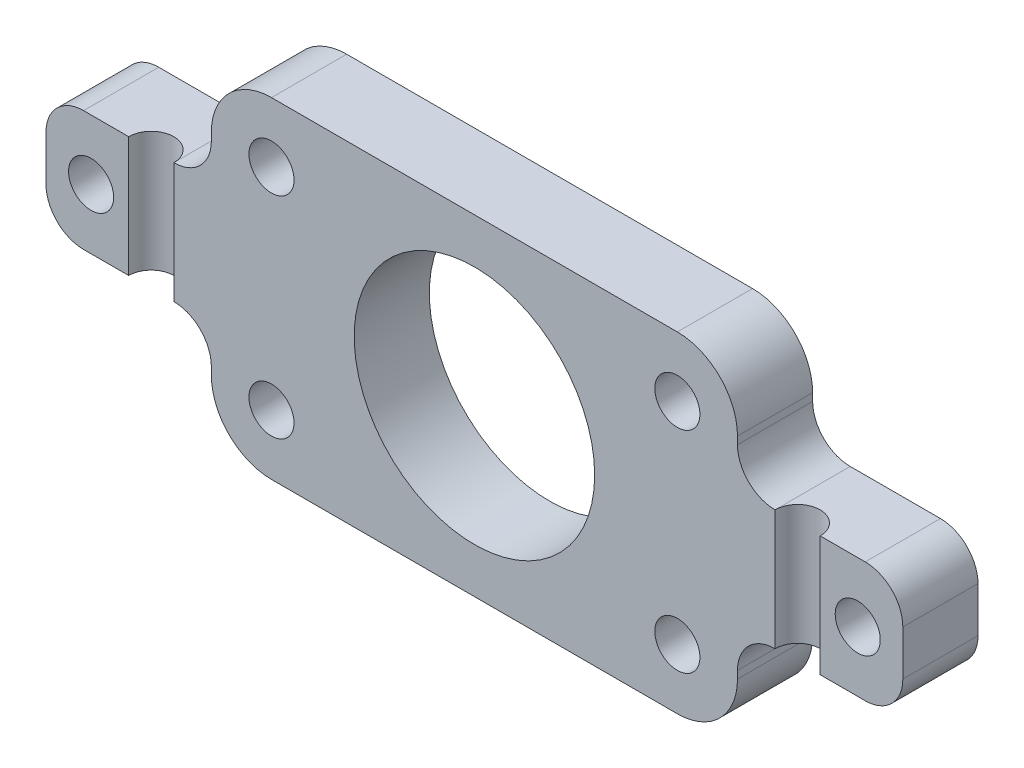
ISO-10303-21;
HEADER;
FILE_DESCRIPTION(('STEP AP214'),'2;1');
FILE_NAME('part.step','',(''),(''),'','','');
FILE_SCHEMA(('AUTOMOTIVE_DESIGN { 1 0 10303 214 1 1 1 1 }'));
ENDSEC;
DATA;
#1=APPLICATION_CONTEXT('core data for automotive mechanical design processes');
#2=APPLICATION_PROTOCOL_DEFINITION('international standard','automotive_design',2000,#1);
#3=PRODUCT_CONTEXT('',#1,'mechanical');
#4=PRODUCT('Part','Part','',(#3));
#5=PRODUCT_RELATED_PRODUCT_CATEGORY('part','',(#4));
#6=PRODUCT_DEFINITION_FORMATION('','',#4);
#7=PRODUCT_DEFINITION_CONTEXT('part definition',#1,'design');
#8=PRODUCT_DEFINITION('design','',#6,#7);
#9=PRODUCT_DEFINITION_SHAPE('','',#8);
#10=(LENGTH_UNIT() NAMED_UNIT(*) SI_UNIT(.MILLI.,.METRE.));
#11=(NAMED_UNIT(*) PLANE_ANGLE_UNIT() SI_UNIT($,.RADIAN.));
#12=(NAMED_UNIT(*) SI_UNIT($,.STERADIAN.) SOLID_ANGLE_UNIT());
#13=UNCERTAINTY_MEASURE_WITH_UNIT(LENGTH_MEASURE(1.E-05),#10,'distance_accuracy_value','');
#14=(GEOMETRIC_REPRESENTATION_CONTEXT(3) GLOBAL_UNCERTAINTY_ASSIGNED_CONTEXT((#13)) GLOBAL_UNIT_ASSIGNED_CONTEXT((#10,
#11,#12)) REPRESENTATION_CONTEXT('',''));
#15=CARTESIAN_POINT('',(0.,0.,0.));
#16=DIRECTION('',(0.,0.,1.));
#17=DIRECTION('',(1.,0.,0.));
#18=AXIS2_PLACEMENT_3D('',#15,#16,#17);
#19=CARTESIAN_POINT('',(15.,4.,5.));
#20=DIRECTION('',(0.,0.,1.));
#21=DIRECTION('',(1.,0.,0.));
#22=AXIS2_PLACEMENT_3D('',#19,#20,#21);
#23=PLANE('',#22);
#24=DIRECTION('',(0.,1.,0.));
#25=VECTOR('',#24,1.);
#26=CARTESIAN_POINT('',(8.5,3.5,5.));
#27=LINE('',#26,#25);
#28=CARTESIAN_POINT('',(8.5,7.,5.));
#29=VERTEX_POINT('',#28);
#30=CARTESIAN_POINT('',(8.5,15.,5.));
#31=VERTEX_POINT('',#30);
#32=EDGE_CURVE('E205',#29,#31,#27,.T.);
#33=ORIENTED_EDGE('',*,*,#32,.F.);
#34=CARTESIAN_POINT('',(8.5,4.5,5.));
#35=DIRECTION('',(0.,0.,-1.));
#36=DIRECTION('',(1.,0.,0.));
#37=AXIS2_PLACEMENT_3D('',#34,#35,#36);
#38=CIRCLE('',#37,2.5);
#39=CARTESIAN_POINT('',(11.,4.5,5.));
#40=VERTEX_POINT('',#39);
#41=EDGE_CURVE('E388',#29,#40,#38,.T.);
#42=ORIENTED_EDGE('',*,*,#41,.T.);
#43=DIRECTION('',(0.,-1.,0.));
#44=VECTOR('',#43,1.);
#45=CARTESIAN_POINT('',(11.,4.5,5.));
#46=LINE('',#45,#44);
#47=CARTESIAN_POINT('',(11.,4.,5.));
#48=VERTEX_POINT('',#47);
#49=EDGE_CURVE('E353',#40,#48,#46,.T.);
#50=ORIENTED_EDGE('',*,*,#49,.T.);
#51=CARTESIAN_POINT('',(15.,4.,5.));
#52=DIRECTION('',(0.,0.,1.));
#53=DIRECTION('',(1.,0.,0.));
#54=AXIS2_PLACEMENT_3D('',#51,#52,#53);
#55=CIRCLE('',#54,4.);
#56=CARTESIAN_POINT('',(15.,0.,5.));
#57=VERTEX_POINT('',#56);
#58=EDGE_CURVE('E348',#48,#57,#55,.T.);
#59=ORIENTED_EDGE('',*,*,#58,.T.);
#60=DIRECTION('',(1.,0.,0.));
#61=VECTOR('',#60,1.);
#62=CARTESIAN_POINT('',(15.,0.,5.));
#63=LINE('',#62,#61);
#64=CARTESIAN_POINT('',(42.,0.,5.));
#65=VERTEX_POINT('',#64);
#66=EDGE_CURVE('E413',#57,#65,#63,.T.);
#67=ORIENTED_EDGE('',*,*,#66,.T.);
#68=CARTESIAN_POINT('',(42.,4.,5.));
#69=DIRECTION('',(0.,0.,1.));
#70=DIRECTION('',(-1.,0.,0.));
#71=AXIS2_PLACEMENT_3D('',#68,#69,#70);
#72=CIRCLE('',#71,4.);
#73=CARTESIAN_POINT('',(46.,4.,5.));
#74=VERTEX_POINT('',#73);
#75=EDGE_CURVE('E293',#65,#74,#72,.T.);
#76=ORIENTED_EDGE('',*,*,#75,.T.);
#77=DIRECTION('',(0.,1.,0.));
#78=VECTOR('',#77,1.);
#79=CARTESIAN_POINT('',(46.,4.5,5.));
#80=LINE('',#79,#78);
#81=CARTESIAN_POINT('',(46.,4.5,5.));
#82=VERTEX_POINT('',#81);
#83=EDGE_CURVE('E416',#74,#82,#80,.T.);
#84=ORIENTED_EDGE('',*,*,#83,.T.);
#85=CARTESIAN_POINT('',(48.5,4.5,5.));
#86=DIRECTION('',(0.,0.,-1.));
#87=DIRECTION('',(-1.,0.,0.));
#88=AXIS2_PLACEMENT_3D('',#85,#86,#87);
#89=CIRCLE('',#88,2.5);
#90=CARTESIAN_POINT('',(48.5,7.,5.));
#91=VERTEX_POINT('',#90);
#92=EDGE_CURVE('E418',#82,#91,#89,.T.);
#93=ORIENTED_EDGE('',*,*,#92,.T.);
#94=DIRECTION('',(0.,1.,0.));
#95=VECTOR('',#94,1.);
#96=CARTESIAN_POINT('',(48.5,3.5,5.));
#97=LINE('',#96,#95);
#98=CARTESIAN_POINT('',(48.5,15.,4.99999999999999));
#99=VERTEX_POINT('',#98);
#100=EDGE_CURVE('E687',#99,#91,#97,.F.);
#101=ORIENTED_EDGE('',*,*,#100,.F.);
#102=CARTESIAN_POINT('',(48.5,17.5,5.));
#103=DIRECTION('',(0.,0.,-1.));
#104=DIRECTION('',(1.,0.,0.));
#105=AXIS2_PLACEMENT_3D('',#102,#103,#104);
#106=CIRCLE('',#105,2.5);
#107=CARTESIAN_POINT('',(46.,17.5,5.));
#108=VERTEX_POINT('',#107);
#109=EDGE_CURVE('E432',#99,#108,#106,.T.);
#110=ORIENTED_EDGE('',*,*,#109,.T.);
#111=DIRECTION('',(0.,1.,0.));
#112=VECTOR('',#111,1.);
#113=CARTESIAN_POINT('',(46.,17.5,5.));
#114=LINE('',#113,#112);
#115=CARTESIAN_POINT('',(46.,18.,5.));
#116=VERTEX_POINT('',#115);
#117=EDGE_CURVE('E434',#108,#116,#114,.T.);
#118=ORIENTED_EDGE('',*,*,#117,.T.);
#119=CARTESIAN_POINT('',(42.,18.,5.));
#120=DIRECTION('',(0.,0.,1.));
#121=DIRECTION('',(1.,0.,0.));
#122=AXIS2_PLACEMENT_3D('',#119,#120,#121);
#123=CIRCLE('',#122,4.);
#124=CARTESIAN_POINT('',(42.,22.,5.));
#125=VERTEX_POINT('',#124);
#126=EDGE_CURVE('E436',#116,#125,#123,.T.);
#127=ORIENTED_EDGE('',*,*,#126,.T.);
#128=DIRECTION('',(-1.,0.,0.));
#129=VECTOR('',#128,1.);
#130=CARTESIAN_POINT('',(42.,22.,5.));
#131=LINE('',#130,#129);
#132=CARTESIAN_POINT('',(15.,22.,5.));
#133=VERTEX_POINT('',#132);
#134=EDGE_CURVE('E438',#125,#133,#131,.T.);
#135=ORIENTED_EDGE('',*,*,#134,.T.);
#136=CARTESIAN_POINT('',(15.,18.,5.));
#137=DIRECTION('',(0.,0.,1.));
#138=DIRECTION('',(-1.,0.,0.));
#139=AXIS2_PLACEMENT_3D('',#136,#137,#138);
#140=CIRCLE('',#139,4.);
#141=CARTESIAN_POINT('',(11.,18.,5.));
#142=VERTEX_POINT('',#141);
#143=EDGE_CURVE('E440',#133,#142,#140,.T.);
#144=ORIENTED_EDGE('',*,*,#143,.T.);
#145=DIRECTION('',(0.,-1.,0.));
#146=VECTOR('',#145,1.);
#147=CARTESIAN_POINT('',(11.,17.5,5.));
#148=LINE('',#147,#146);
#149=CARTESIAN_POINT('',(11.,17.5,5.));
#150=VERTEX_POINT('',#149);
#151=EDGE_CURVE('E230',#142,#150,#148,.T.);
#152=ORIENTED_EDGE('',*,*,#151,.T.);
#153=CARTESIAN_POINT('',(8.5,17.5,5.));
#154=DIRECTION('',(0.,0.,-1.));
#155=DIRECTION('',(1.,0.,0.));
#156=AXIS2_PLACEMENT_3D('',#153,#154,#155);
#157=CIRCLE('',#156,2.5);
#158=EDGE_CURVE('E227',#150,#31,#157,.T.);
#159=ORIENTED_EDGE('',*,*,#158,.T.);
#160=EDGE_LOOP('',(#33,#42,#50,#59,#67,#76,#84,#93,#101,#110,#118,#127,#135,#144,#152,#159));
#161=FACE_BOUND('',#160,.T.);
#162=CARTESIAN_POINT('',(42.,4.,5.));
#163=DIRECTION('',(0.,0.,1.));
#164=DIRECTION('',(1.,0.,0.));
#165=AXIS2_PLACEMENT_3D('',#162,#163,#164);
#166=CIRCLE('',#165,1.5);
#167=CARTESIAN_POINT('',(43.5,4.,5.));
#168=VERTEX_POINT('',#167);
#169=EDGE_CURVE('E694',#168,#168,#166,.T.);
#170=ORIENTED_EDGE('',*,*,#169,.F.);
#171=EDGE_LOOP('',(#170));
#172=FACE_BOUND('',#171,.T.);
#173=CARTESIAN_POINT('',(15.,4.,5.));
#174=DIRECTION('',(0.,0.,1.));
#175=DIRECTION('',(-1.,0.,0.));
#176=AXIS2_PLACEMENT_3D('',#173,#174,#175);
#177=CIRCLE('',#176,1.5);
#178=CARTESIAN_POINT('',(13.5,4.,5.));
#179=VERTEX_POINT('',#178);
#180=EDGE_CURVE('E702',#179,#179,#177,.T.);
#181=ORIENTED_EDGE('',*,*,#180,.F.);
#182=EDGE_LOOP('',(#181));
#183=FACE_BOUND('',#182,.T.);
#184=CARTESIAN_POINT('',(28.5,11.,5.));
#185=DIRECTION('',(0.,0.,1.));
#186=DIRECTION('',(1.,0.,0.));
#187=AXIS2_PLACEMENT_3D('',#184,#185,#186);
#188=CIRCLE('',#187,7.99999999999999);
#189=CARTESIAN_POINT('',(36.5,11.,5.));
#190=VERTEX_POINT('',#189);
#191=EDGE_CURVE('E396',#190,#190,#188,.T.);
#192=ORIENTED_EDGE('',*,*,#191,.F.);
#193=EDGE_LOOP('',(#192));
#194=FACE_BOUND('',#193,.T.);
#195=CARTESIAN_POINT('',(15.,18.,5.));
#196=DIRECTION('',(0.,0.,1.));
#197=DIRECTION('',(1.,0.,0.));
#198=AXIS2_PLACEMENT_3D('',#195,#196,#197);
#199=CIRCLE('',#198,1.5);
#200=CARTESIAN_POINT('',(16.5,18.,5.));
#201=VERTEX_POINT('',#200);
#202=EDGE_CURVE('E405',#201,#201,#199,.T.);
#203=ORIENTED_EDGE('',*,*,#202,.F.);
#204=EDGE_LOOP('',(#203));
#205=FACE_BOUND('',#204,.T.);
#206=CARTESIAN_POINT('',(42.,18.,5.));
#207=DIRECTION('',(0.,0.,1.));
#208=DIRECTION('',(-1.,0.,0.));
#209=AXIS2_PLACEMENT_3D('',#206,#207,#208);
#210=CIRCLE('',#209,1.5);
#211=CARTESIAN_POINT('',(40.5,18.,5.));
#212=VERTEX_POINT('',#211);
#213=EDGE_CURVE('E698',#212,#212,#210,.T.);
#214=ORIENTED_EDGE('',*,*,#213,.F.);
#215=EDGE_LOOP('',(#214));
#216=FACE_BOUND('',#215,.T.);
#217=ADVANCED_FACE('F34',(#161,#172,#183,#194,#205,#216),#23,.T.);
#218=DIRECTION('',(0.,1.,0.));
#219=VECTOR('',#218,1.);
#220=CARTESIAN_POINT('',(51.5,3.5,5.));
#221=LINE('',#220,#219);
#222=CARTESIAN_POINT('',(51.5,7.,5.));
#223=VERTEX_POINT('',#222);
#224=CARTESIAN_POINT('',(51.5,15.,5.));
#225=VERTEX_POINT('',#224);
#226=EDGE_CURVE('E49',#223,#225,#221,.T.);
#227=ORIENTED_EDGE('',*,*,#226,.F.);
#228=DIRECTION('',(1.,0.,0.));
#229=VECTOR('',#228,1.);
#230=CARTESIAN_POINT('',(54.5,7.,5.));
#231=LINE('',#230,#229);
#232=CARTESIAN_POINT('',(54.5,7.,5.));
#233=VERTEX_POINT('',#232);
#234=EDGE_CURVE('E421',#223,#233,#231,.T.);
#235=ORIENTED_EDGE('',*,*,#234,.T.);
#236=CARTESIAN_POINT('',(54.5,9.5,5.));
#237=DIRECTION('',(0.,0.,1.));
#238=DIRECTION('',(1.,0.,0.));
#239=AXIS2_PLACEMENT_3D('',#236,#237,#238);
#240=CIRCLE('',#239,2.5);
#241=CARTESIAN_POINT('',(57.,9.5,5.));
#242=VERTEX_POINT('',#241);
#243=EDGE_CURVE('E423',#233,#242,#240,.T.);
#244=ORIENTED_EDGE('',*,*,#243,.T.);
#245=DIRECTION('',(0.,1.,0.));
#246=VECTOR('',#245,1.);
#247=CARTESIAN_POINT('',(57.,9.5,5.));
#248=LINE('',#247,#246);
#249=CARTESIAN_POINT('',(57.,12.5,5.));
#250=VERTEX_POINT('',#249);
#251=EDGE_CURVE('E425',#242,#250,#248,.T.);
#252=ORIENTED_EDGE('',*,*,#251,.T.);
#253=CARTESIAN_POINT('',(54.5,12.5,5.));
#254=DIRECTION('',(0.,0.,1.));
#255=DIRECTION('',(-1.,0.,0.));
#256=AXIS2_PLACEMENT_3D('',#253,#254,#255);
#257=CIRCLE('',#256,2.5);
#258=CARTESIAN_POINT('',(54.5,15.,5.));
#259=VERTEX_POINT('',#258);
#260=EDGE_CURVE('E427',#250,#259,#257,.T.);
#261=ORIENTED_EDGE('',*,*,#260,.T.);
#262=DIRECTION('',(-1.,0.,0.));
#263=VECTOR('',#262,1.);
#264=CARTESIAN_POINT('',(54.5,15.,5.));
#265=LINE('',#264,#263);
#266=EDGE_CURVE('E429',#259,#225,#265,.T.);
#267=ORIENTED_EDGE('',*,*,#266,.T.);
#268=EDGE_LOOP('',(#227,#235,#244,#252,#261,#267));
#269=FACE_BOUND('',#268,.T.);
#270=CARTESIAN_POINT('',(54.,11.,5.));
#271=DIRECTION('',(0.,0.,1.));
#272=DIRECTION('',(-1.,0.,0.));
#273=AXIS2_PLACEMENT_3D('',#270,#271,#272);
#274=CIRCLE('',#273,1.5);
#275=CARTESIAN_POINT('',(52.5,11.,5.));
#276=VERTEX_POINT('',#275);
#277=EDGE_CURVE('E683',#276,#276,#274,.T.);
#278=ORIENTED_EDGE('',*,*,#277,.F.);
#279=EDGE_LOOP('',(#278));
#280=FACE_BOUND('',#279,.T.);
#281=ADVANCED_FACE('F532',(#269,#280),#23,.T.);
#282=DIRECTION('',(0.,1.,0.));
#283=VECTOR('',#282,1.);
#284=CARTESIAN_POINT('',(5.5,3.5,5.));
#285=LINE('',#284,#283);
#286=CARTESIAN_POINT('',(5.5,15.,5.));
#287=VERTEX_POINT('',#286);
#288=CARTESIAN_POINT('',(5.5,7.,5.));
#289=VERTEX_POINT('',#288);
#290=EDGE_CURVE('E57',#287,#289,#285,.F.);
#291=ORIENTED_EDGE('',*,*,#290,.F.);
#292=DIRECTION('',(-1.,0.,0.));
#293=VECTOR('',#292,1.);
#294=CARTESIAN_POINT('',(2.49999999999999,15.,5.));
#295=LINE('',#294,#293);
#296=CARTESIAN_POINT('',(2.49999999999999,15.,5.));
#297=VERTEX_POINT('',#296);
#298=EDGE_CURVE('E223',#287,#297,#295,.T.);
#299=ORIENTED_EDGE('',*,*,#298,.T.);
#300=CARTESIAN_POINT('',(2.5,12.5,5.));
#301=DIRECTION('',(0.,0.,1.));
#302=DIRECTION('',(1.,0.,0.));
#303=AXIS2_PLACEMENT_3D('',#300,#301,#302);
#304=CIRCLE('',#303,2.5);
#305=CARTESIAN_POINT('',(0.,12.5,5.));
#306=VERTEX_POINT('',#305);
#307=EDGE_CURVE('E444',#297,#306,#304,.T.);
#308=ORIENTED_EDGE('',*,*,#307,.T.);
#309=DIRECTION('',(0.,-1.,0.));
#310=VECTOR('',#309,1.);
#311=CARTESIAN_POINT('',(0.,12.5,5.));
#312=LINE('',#311,#310);
#313=CARTESIAN_POINT('',(0.,9.5,5.));
#314=VERTEX_POINT('',#313);
#315=EDGE_CURVE('E371',#306,#314,#312,.T.);
#316=ORIENTED_EDGE('',*,*,#315,.T.);
#317=CARTESIAN_POINT('',(2.5,9.5,5.));
#318=DIRECTION('',(0.,0.,1.));
#319=DIRECTION('',(-1.,0.,0.));
#320=AXIS2_PLACEMENT_3D('',#317,#318,#319);
#321=CIRCLE('',#320,2.5);
#322=CARTESIAN_POINT('',(2.49999999999999,7.,5.));
#323=VERTEX_POINT('',#322);
#324=EDGE_CURVE('E389',#314,#323,#321,.T.);
#325=ORIENTED_EDGE('',*,*,#324,.T.);
#326=DIRECTION('',(1.,0.,0.));
#327=VECTOR('',#326,1.);
#328=CARTESIAN_POINT('',(2.49999999999999,7.,5.));
#329=LINE('',#328,#327);
#330=EDGE_CURVE('E386',#323,#289,#329,.T.);
#331=ORIENTED_EDGE('',*,*,#330,.T.);
#332=EDGE_LOOP('',(#291,#299,#308,#316,#325,#331));
#333=FACE_BOUND('',#332,.T.);
#334=CARTESIAN_POINT('',(3.,11.,5.));
#335=DIRECTION('',(0.,0.,1.));
#336=DIRECTION('',(1.,0.,0.));
#337=AXIS2_PLACEMENT_3D('',#334,#335,#336);
#338=CIRCLE('',#337,1.5);
#339=CARTESIAN_POINT('',(4.5,11.,5.));
#340=VERTEX_POINT('',#339);
#341=EDGE_CURVE('E690',#340,#340,#338,.T.);
#342=ORIENTED_EDGE('',*,*,#341,.F.);
#343=EDGE_LOOP('',(#342));
#344=FACE_BOUND('',#343,.T.);
#345=ADVANCED_FACE('F445',(#333,#344),#23,.T.);
#346=CARTESIAN_POINT('',(15.,4.,0.));
#347=DIRECTION('',(0.,0.,1.));
#348=DIRECTION('',(1.,0.,0.));
#349=AXIS2_PLACEMENT_3D('',#346,#347,#348);
#350=PLANE('',#349);
#351=CARTESIAN_POINT('',(15.,4.,0.));
#352=DIRECTION('',(0.,0.,1.));
#353=DIRECTION('',(1.,0.,0.));
#354=AXIS2_PLACEMENT_3D('',#351,#352,#353);
#355=CIRCLE('',#354,4.);
#356=CARTESIAN_POINT('',(11.,4.,0.));
#357=VERTEX_POINT('',#356);
#358=CARTESIAN_POINT('',(15.,0.,0.));
#359=VERTEX_POINT('',#358);
#360=EDGE_CURVE('E306',#357,#359,#355,.T.);
#361=ORIENTED_EDGE('',*,*,#360,.F.);
#362=DIRECTION('',(0.,-1.,0.));
#363=VECTOR('',#362,1.);
#364=CARTESIAN_POINT('',(11.,4.5,0.));
#365=LINE('',#364,#363);
#366=CARTESIAN_POINT('',(11.,4.5,0.));
#367=VERTEX_POINT('',#366);
#368=EDGE_CURVE('E346',#367,#357,#365,.T.);
#369=ORIENTED_EDGE('',*,*,#368,.F.);
#370=CARTESIAN_POINT('',(8.5,4.5,0.));
#371=DIRECTION('',(0.,0.,-1.));
#372=DIRECTION('',(1.,0.,0.));
#373=AXIS2_PLACEMENT_3D('',#370,#371,#372);
#374=CIRCLE('',#373,2.5);
#375=CARTESIAN_POINT('',(8.5,7.,0.));
#376=VERTEX_POINT('',#375);
#377=EDGE_CURVE('E344',#376,#367,#374,.T.);
#378=ORIENTED_EDGE('',*,*,#377,.F.);
#379=DIRECTION('',(1.,0.,0.));
#380=VECTOR('',#379,1.);
#381=CARTESIAN_POINT('',(2.49999999999999,7.,0.));
#382=LINE('',#381,#380);
#383=CARTESIAN_POINT('',(2.49999999999999,7.,0.));
#384=VERTEX_POINT('',#383);
#385=EDGE_CURVE('E342',#384,#376,#382,.T.);
#386=ORIENTED_EDGE('',*,*,#385,.F.);
#387=CARTESIAN_POINT('',(2.5,9.5,0.));
#388=DIRECTION('',(0.,0.,1.));
#389=DIRECTION('',(-1.,0.,0.));
#390=AXIS2_PLACEMENT_3D('',#387,#388,#389);
#391=CIRCLE('',#390,2.5);
#392=CARTESIAN_POINT('',(0.,9.5,0.));
#393=VERTEX_POINT('',#392);
#394=EDGE_CURVE('E340',#393,#384,#391,.T.);
#395=ORIENTED_EDGE('',*,*,#394,.F.);
#396=DIRECTION('',(0.,-1.,0.));
#397=VECTOR('',#396,1.);
#398=CARTESIAN_POINT('',(0.,12.5,0.));
#399=LINE('',#398,#397);
#400=CARTESIAN_POINT('',(0.,12.5,0.));
#401=VERTEX_POINT('',#400);
#402=EDGE_CURVE('E338',#401,#393,#399,.T.);
#403=ORIENTED_EDGE('',*,*,#402,.F.);
#404=CARTESIAN_POINT('',(2.5,12.5,0.));
#405=DIRECTION('',(0.,0.,1.));
#406=DIRECTION('',(1.,0.,0.));
#407=AXIS2_PLACEMENT_3D('',#404,#405,#406);
#408=CIRCLE('',#407,2.5);
#409=CARTESIAN_POINT('',(2.49999999999999,15.,0.));
#410=VERTEX_POINT('',#409);
#411=EDGE_CURVE('E336',#410,#401,#408,.T.);
#412=ORIENTED_EDGE('',*,*,#411,.F.);
#413=DIRECTION('',(-1.,0.,0.));
#414=VECTOR('',#413,1.);
#415=CARTESIAN_POINT('',(2.49999999999999,15.,0.));
#416=LINE('',#415,#414);
#417=CARTESIAN_POINT('',(8.5,15.,0.));
#418=VERTEX_POINT('',#417);
#419=EDGE_CURVE('E334',#418,#410,#416,.T.);
#420=ORIENTED_EDGE('',*,*,#419,.F.);
#421=CARTESIAN_POINT('',(8.5,17.5,0.));
#422=DIRECTION('',(0.,0.,-1.));
#423=DIRECTION('',(1.,0.,0.));
#424=AXIS2_PLACEMENT_3D('',#421,#422,#423);
#425=CIRCLE('',#424,2.5);
#426=CARTESIAN_POINT('',(11.,17.5,0.));
#427=VERTEX_POINT('',#426);
#428=EDGE_CURVE('E237',#427,#418,#425,.T.);
#429=ORIENTED_EDGE('',*,*,#428,.F.);
#430=DIRECTION('',(0.,-1.,0.));
#431=VECTOR('',#430,1.);
#432=CARTESIAN_POINT('',(11.,17.5,0.));
#433=LINE('',#432,#431);
#434=CARTESIAN_POINT('',(11.,18.,0.));
#435=VERTEX_POINT('',#434);
#436=EDGE_CURVE('E331',#435,#427,#433,.T.);
#437=ORIENTED_EDGE('',*,*,#436,.F.);
#438=CARTESIAN_POINT('',(15.,18.,0.));
#439=DIRECTION('',(0.,0.,1.));
#440=DIRECTION('',(-1.,0.,0.));
#441=AXIS2_PLACEMENT_3D('',#438,#439,#440);
#442=CIRCLE('',#441,4.);
#443=CARTESIAN_POINT('',(15.,22.,0.));
#444=VERTEX_POINT('',#443);
#445=EDGE_CURVE('E329',#444,#435,#442,.T.);
#446=ORIENTED_EDGE('',*,*,#445,.F.);
#447=DIRECTION('',(-1.,0.,0.));
#448=VECTOR('',#447,1.);
#449=CARTESIAN_POINT('',(42.,22.,0.));
#450=LINE('',#449,#448);
#451=CARTESIAN_POINT('',(42.,22.,0.));
#452=VERTEX_POINT('',#451);
#453=EDGE_CURVE('E327',#452,#444,#450,.T.);
#454=ORIENTED_EDGE('',*,*,#453,.F.);
#455=CARTESIAN_POINT('',(42.,18.,0.));
#456=DIRECTION('',(0.,0.,1.));
#457=DIRECTION('',(1.,0.,0.));
#458=AXIS2_PLACEMENT_3D('',#455,#456,#457);
#459=CIRCLE('',#458,4.);
#460=CARTESIAN_POINT('',(46.,18.,0.));
#461=VERTEX_POINT('',#460);
#462=EDGE_CURVE('E325',#461,#452,#459,.T.);
#463=ORIENTED_EDGE('',*,*,#462,.F.);
#464=DIRECTION('',(0.,1.,0.));
#465=VECTOR('',#464,1.);
#466=CARTESIAN_POINT('',(46.,17.5,0.));
#467=LINE('',#466,#465);
#468=CARTESIAN_POINT('',(46.,17.5,0.));
#469=VERTEX_POINT('',#468);
#470=EDGE_CURVE('E323',#469,#461,#467,.T.);
#471=ORIENTED_EDGE('',*,*,#470,.F.);
#472=CARTESIAN_POINT('',(48.5,17.5,0.));
#473=DIRECTION('',(0.,0.,-1.));
#474=DIRECTION('',(1.,0.,0.));
#475=AXIS2_PLACEMENT_3D('',#472,#473,#474);
#476=CIRCLE('',#475,2.5);
#477=CARTESIAN_POINT('',(48.5,15.,0.));
#478=VERTEX_POINT('',#477);
#479=EDGE_CURVE('E321',#478,#469,#476,.T.);
#480=ORIENTED_EDGE('',*,*,#479,.F.);
#481=DIRECTION('',(-1.,0.,0.));
#482=VECTOR('',#481,1.);
#483=CARTESIAN_POINT('',(54.5,15.,0.));
#484=LINE('',#483,#482);
#485=CARTESIAN_POINT('',(54.5,15.,0.));
#486=VERTEX_POINT('',#485);
#487=EDGE_CURVE('E319',#486,#478,#484,.T.);
#488=ORIENTED_EDGE('',*,*,#487,.F.);
#489=CARTESIAN_POINT('',(54.5,12.5,0.));
#490=DIRECTION('',(0.,0.,1.));
#491=DIRECTION('',(-1.,0.,0.));
#492=AXIS2_PLACEMENT_3D('',#489,#490,#491);
#493=CIRCLE('',#492,2.5);
#494=CARTESIAN_POINT('',(57.,12.5,0.));
#495=VERTEX_POINT('',#494);
#496=EDGE_CURVE('E317',#495,#486,#493,.T.);
#497=ORIENTED_EDGE('',*,*,#496,.F.);
#498=DIRECTION('',(0.,1.,0.));
#499=VECTOR('',#498,1.);
#500=CARTESIAN_POINT('',(57.,9.5,0.));
#501=LINE('',#500,#499);
#502=CARTESIAN_POINT('',(57.,9.5,0.));
#503=VERTEX_POINT('',#502);
#504=EDGE_CURVE('E315',#503,#495,#501,.T.);
#505=ORIENTED_EDGE('',*,*,#504,.F.);
#506=CARTESIAN_POINT('',(54.5,9.5,0.));
#507=DIRECTION('',(0.,0.,1.));
#508=DIRECTION('',(1.,0.,0.));
#509=AXIS2_PLACEMENT_3D('',#506,#507,#508);
#510=CIRCLE('',#509,2.5);
#511=CARTESIAN_POINT('',(54.5,7.,0.));
#512=VERTEX_POINT('',#511);
#513=EDGE_CURVE('E313',#512,#503,#510,.T.);
#514=ORIENTED_EDGE('',*,*,#513,.F.);
#515=DIRECTION('',(1.,0.,0.));
#516=VECTOR('',#515,1.);
#517=CARTESIAN_POINT('',(54.5,7.,0.));
#518=LINE('',#517,#516);
#519=CARTESIAN_POINT('',(48.5,7.,0.));
#520=VERTEX_POINT('',#519);
#521=EDGE_CURVE('E311',#520,#512,#518,.T.);
#522=ORIENTED_EDGE('',*,*,#521,.F.);
#523=CARTESIAN_POINT('',(48.5,4.5,0.));
#524=DIRECTION('',(0.,0.,-1.));
#525=DIRECTION('',(-1.,0.,0.));
#526=AXIS2_PLACEMENT_3D('',#523,#524,#525);
#527=CIRCLE('',#526,2.5);
#528=CARTESIAN_POINT('',(46.,4.5,0.));
#529=VERTEX_POINT('',#528);
#530=EDGE_CURVE('E304',#529,#520,#527,.T.);
#531=ORIENTED_EDGE('',*,*,#530,.F.);
#532=DIRECTION('',(0.,1.,0.));
#533=VECTOR('',#532,1.);
#534=CARTESIAN_POINT('',(46.,4.5,0.));
#535=LINE('',#534,#533);
#536=CARTESIAN_POINT('',(46.,4.,0.));
#537=VERTEX_POINT('',#536);
#538=EDGE_CURVE('E302',#537,#529,#535,.T.);
#539=ORIENTED_EDGE('',*,*,#538,.F.);
#540=CARTESIAN_POINT('',(42.,4.,0.));
#541=DIRECTION('',(0.,0.,1.));
#542=DIRECTION('',(-1.,0.,0.));
#543=AXIS2_PLACEMENT_3D('',#540,#541,#542);
#544=CIRCLE('',#543,4.);
#545=CARTESIAN_POINT('',(42.,0.,0.));
#546=VERTEX_POINT('',#545);
#547=EDGE_CURVE('E292',#546,#537,#544,.T.);
#548=ORIENTED_EDGE('',*,*,#547,.F.);
#549=DIRECTION('',(1.,0.,0.));
#550=VECTOR('',#549,1.);
#551=CARTESIAN_POINT('',(15.,0.,0.));
#552=LINE('',#551,#550);
#553=EDGE_CURVE('E300',#359,#546,#552,.T.);
#554=ORIENTED_EDGE('',*,*,#553,.F.);
#555=EDGE_LOOP('',(#361,#369,#378,#386,#395,#403,#412,#420,#429,#437,#446,#454,#463,#471,#480,
#488,#497,#505,#514,#522,#531,#539,#548,#554));
#556=FACE_BOUND('',#555,.T.);
#557=CARTESIAN_POINT('',(28.5,11.,0.));
#558=DIRECTION('',(0.,0.,1.));
#559=DIRECTION('',(1.,0.,0.));
#560=AXIS2_PLACEMENT_3D('',#557,#558,#559);
#561=CIRCLE('',#560,7.99999999999999);
#562=CARTESIAN_POINT('',(36.5,11.,0.));
#563=VERTEX_POINT('',#562);
#564=EDGE_CURVE('E400',#563,#563,#561,.T.);
#565=ORIENTED_EDGE('',*,*,#564,.T.);
#566=EDGE_LOOP('',(#565));
#567=FACE_BOUND('',#566,.T.);
#568=CARTESIAN_POINT('',(15.,18.,0.));
#569=DIRECTION('',(0.,0.,1.));
#570=DIRECTION('',(1.,0.,0.));
#571=AXIS2_PLACEMENT_3D('',#568,#569,#570);
#572=CIRCLE('',#571,1.5);
#573=CARTESIAN_POINT('',(16.5,18.,0.));
#574=VERTEX_POINT('',#573);
#575=EDGE_CURVE('E408',#574,#574,#572,.T.);
#576=ORIENTED_EDGE('',*,*,#575,.T.);
#577=EDGE_LOOP('',(#576));
#578=FACE_BOUND('',#577,.T.);
#579=CARTESIAN_POINT('',(15.,4.,0.));
#580=DIRECTION('',(0.,0.,1.));
#581=DIRECTION('',(-1.,0.,0.));
#582=AXIS2_PLACEMENT_3D('',#579,#580,#581);
#583=CIRCLE('',#582,1.5);
#584=CARTESIAN_POINT('',(13.5,4.,0.));
#585=VERTEX_POINT('',#584);
#586=EDGE_CURVE('E666',#585,#585,#583,.T.);
#587=ORIENTED_EDGE('',*,*,#586,.T.);
#588=EDGE_LOOP('',(#587));
#589=FACE_BOUND('',#588,.T.);
#590=CARTESIAN_POINT('',(42.,18.,0.));
#591=DIRECTION('',(0.,0.,1.));
#592=DIRECTION('',(-1.,0.,0.));
#593=AXIS2_PLACEMENT_3D('',#590,#591,#592);
#594=CIRCLE('',#593,1.5);
#595=CARTESIAN_POINT('',(40.5,18.,0.));
#596=VERTEX_POINT('',#595);
#597=EDGE_CURVE('E670',#596,#596,#594,.T.);
#598=ORIENTED_EDGE('',*,*,#597,.T.);
#599=EDGE_LOOP('',(#598));
#600=FACE_BOUND('',#599,.T.);
#601=CARTESIAN_POINT('',(42.,4.,0.));
#602=DIRECTION('',(0.,0.,1.));
#603=DIRECTION('',(1.,0.,0.));
#604=AXIS2_PLACEMENT_3D('',#601,#602,#603);
#605=CIRCLE('',#604,1.5);
#606=CARTESIAN_POINT('',(43.5,4.,0.));
#607=VERTEX_POINT('',#606);
#608=EDGE_CURVE('E674',#607,#607,#605,.T.);
#609=ORIENTED_EDGE('',*,*,#608,.T.);
#610=EDGE_LOOP('',(#609));
#611=FACE_BOUND('',#610,.T.);
#612=CARTESIAN_POINT('',(3.,11.,0.));
#613=DIRECTION('',(0.,0.,1.));
#614=DIRECTION('',(1.,0.,0.));
#615=AXIS2_PLACEMENT_3D('',#612,#613,#614);
#616=CIRCLE('',#615,1.5);
#617=CARTESIAN_POINT('',(4.5,11.,0.));
#618=VERTEX_POINT('',#617);
#619=EDGE_CURVE('E678',#618,#618,#616,.T.);
#620=ORIENTED_EDGE('',*,*,#619,.T.);
#621=EDGE_LOOP('',(#620));
#622=FACE_BOUND('',#621,.T.);
#623=CARTESIAN_POINT('',(54.,11.,0.));
#624=DIRECTION('',(0.,0.,1.));
#625=DIRECTION('',(-1.,0.,0.));
#626=AXIS2_PLACEMENT_3D('',#623,#624,#625);
#627=CIRCLE('',#626,1.5);
#628=CARTESIAN_POINT('',(52.5,11.,0.));
#629=VERTEX_POINT('',#628);
#630=EDGE_CURVE('E681',#629,#629,#627,.T.);
#631=ORIENTED_EDGE('',*,*,#630,.T.);
#632=EDGE_LOOP('',(#631));
#633=FACE_BOUND('',#632,.T.);
#634=ADVANCED_FACE('F298',(#556,#567,#578,#589,#600,#611,#622,#633),#350,.F.);
#635=CARTESIAN_POINT('',(15.,4.,5.));
#636=DIRECTION('',(0.,0.,-1.));
#637=DIRECTION('',(-1.,0.,0.));
#638=AXIS2_PLACEMENT_3D('',#635,#636,#637);
#639=CYLINDRICAL_SURFACE('',#638,4.);
#640=ORIENTED_EDGE('',*,*,#360,.T.);
#641=DIRECTION('',(0.,0.,-1.));
#642=VECTOR('',#641,1.);
#643=CARTESIAN_POINT('',(15.,0.,5.));
#644=LINE('',#643,#642);
#645=EDGE_CURVE('E11',#57,#359,#644,.T.);
#646=ORIENTED_EDGE('',*,*,#645,.F.);
#647=ORIENTED_EDGE('',*,*,#58,.F.);
#648=DIRECTION('',(0.,0.,-1.));
#649=VECTOR('',#648,1.);
#650=CARTESIAN_POINT('',(11.,4.,5.));
#651=LINE('',#650,#649);
#652=EDGE_CURVE('E349',#48,#357,#651,.T.);
#653=ORIENTED_EDGE('',*,*,#652,.T.);
#654=EDGE_LOOP('',(#640,#646,#647,#653));
#655=FACE_BOUND('',#654,.T.);
#656=ADVANCED_FACE('F36',(#655),#639,.T.);
#657=CARTESIAN_POINT('',(15.,0.,5.));
#658=DIRECTION('',(0.,1.,0.));
#659=DIRECTION('',(0.,0.,1.));
#660=AXIS2_PLACEMENT_3D('',#657,#658,#659);
#661=PLANE('',#660);
#662=ORIENTED_EDGE('',*,*,#553,.T.);
#663=DIRECTION('',(0.,0.,-1.));
#664=VECTOR('',#663,1.);
#665=CARTESIAN_POINT('',(42.,0.,5.));
#666=LINE('',#665,#664);
#667=EDGE_CURVE('E42',#65,#546,#666,.T.);
#668=ORIENTED_EDGE('',*,*,#667,.F.);
#669=ORIENTED_EDGE('',*,*,#66,.F.);
#670=ORIENTED_EDGE('',*,*,#645,.T.);
#671=EDGE_LOOP('',(#662,#668,#669,#670));
#672=FACE_BOUND('',#671,.T.);
#673=ADVANCED_FACE('F512',(#672),#661,.F.);
#674=CARTESIAN_POINT('',(42.,4.,5.));
#675=DIRECTION('',(0.,0.,-1.));
#676=DIRECTION('',(-1.,0.,0.));
#677=AXIS2_PLACEMENT_3D('',#674,#675,#676);
#678=CYLINDRICAL_SURFACE('',#677,4.);
#679=ORIENTED_EDGE('',*,*,#547,.T.);
#680=DIRECTION('',(0.,0.,-1.));
#681=VECTOR('',#680,1.);
#682=CARTESIAN_POINT('',(46.,4.,5.));
#683=LINE('',#682,#681);
#684=EDGE_CURVE('E283',#74,#537,#683,.T.);
#685=ORIENTED_EDGE('',*,*,#684,.F.);
#686=ORIENTED_EDGE('',*,*,#75,.F.);
#687=ORIENTED_EDGE('',*,*,#667,.T.);
#688=EDGE_LOOP('',(#679,#685,#686,#687));
#689=FACE_BOUND('',#688,.T.);
#690=ADVANCED_FACE('F290',(#689),#678,.T.);
#691=CARTESIAN_POINT('',(46.,4.5,5.));
#692=DIRECTION('',(-1.,0.,0.));
#693=DIRECTION('',(0.,-1.,0.));
#694=AXIS2_PLACEMENT_3D('',#691,#692,#693);
#695=PLANE('',#694);
#696=ORIENTED_EDGE('',*,*,#538,.T.);
#697=DIRECTION('',(0.,0.,-1.));
#698=VECTOR('',#697,1.);
#699=CARTESIAN_POINT('',(46.,4.5,5.));
#700=LINE('',#699,#698);
#701=EDGE_CURVE('E280',#82,#529,#700,.T.);
#702=ORIENTED_EDGE('',*,*,#701,.F.);
#703=ORIENTED_EDGE('',*,*,#83,.F.);
#704=ORIENTED_EDGE('',*,*,#684,.T.);
#705=EDGE_LOOP('',(#696,#702,#703,#704));
#706=FACE_BOUND('',#705,.T.);
#707=ADVANCED_FACE('F509',(#706),#695,.F.);
#708=CARTESIAN_POINT('',(48.5,4.5,5.));
#709=DIRECTION('',(0.,0.,-1.));
#710=DIRECTION('',(-1.,0.,0.));
#711=AXIS2_PLACEMENT_3D('',#708,#709,#710);
#712=CYLINDRICAL_SURFACE('',#711,2.5);
#713=ORIENTED_EDGE('',*,*,#530,.T.);
#714=DIRECTION('',(0.,0.,-1.));
#715=VECTOR('',#714,1.);
#716=CARTESIAN_POINT('',(48.5,7.,5.));
#717=LINE('',#716,#715);
#718=EDGE_CURVE('E277',#91,#520,#717,.T.);
#719=ORIENTED_EDGE('',*,*,#718,.F.);
#720=ORIENTED_EDGE('',*,*,#92,.F.);
#721=ORIENTED_EDGE('',*,*,#701,.T.);
#722=EDGE_LOOP('',(#713,#719,#720,#721));
#723=FACE_BOUND('',#722,.T.);
#724=ADVANCED_FACE('F505',(#723),#712,.F.);
#725=CARTESIAN_POINT('',(54.5,7.,5.));
#726=DIRECTION('',(0.,1.,0.));
#727=DIRECTION('',(0.,0.,1.));
#728=AXIS2_PLACEMENT_3D('',#725,#726,#727);
#729=PLANE('',#728);
#730=ORIENTED_EDGE('',*,*,#234,.F.);
#731=CARTESIAN_POINT('',(50.,7.,4.99999999999999));
#732=DIRECTION('',(0.,1.,0.));
#733=DIRECTION('',(0.,0.,1.));
#734=AXIS2_PLACEMENT_3D('',#731,#732,#733);
#735=CIRCLE('',#734,1.5);
#736=EDGE_CURVE('E213',#223,#91,#735,.T.);
#737=ORIENTED_EDGE('',*,*,#736,.T.);
#738=ORIENTED_EDGE('',*,*,#718,.T.);
#739=ORIENTED_EDGE('',*,*,#521,.T.);
#740=DIRECTION('',(0.,0.,-1.));
#741=VECTOR('',#740,1.);
#742=CARTESIAN_POINT('',(54.5,7.,5.));
#743=LINE('',#742,#741);
#744=EDGE_CURVE('E274',#233,#512,#743,.T.);
#745=ORIENTED_EDGE('',*,*,#744,.F.);
#746=EDGE_LOOP('',(#730,#737,#738,#739,#745));
#747=FACE_BOUND('',#746,.T.);
#748=ADVANCED_FACE('F500',(#747),#729,.F.);
#749=CARTESIAN_POINT('',(54.5,9.5,5.));
#750=DIRECTION('',(0.,0.,-1.));
#751=DIRECTION('',(-1.,0.,0.));
#752=AXIS2_PLACEMENT_3D('',#749,#750,#751);
#753=CYLINDRICAL_SURFACE('',#752,2.5);
#754=ORIENTED_EDGE('',*,*,#513,.T.);
#755=DIRECTION('',(0.,0.,-1.));
#756=VECTOR('',#755,1.);
#757=CARTESIAN_POINT('',(57.,9.5,5.));
#758=LINE('',#757,#756);
#759=EDGE_CURVE('E271',#242,#503,#758,.T.);
#760=ORIENTED_EDGE('',*,*,#759,.F.);
#761=ORIENTED_EDGE('',*,*,#243,.F.);
#762=ORIENTED_EDGE('',*,*,#744,.T.);
#763=EDGE_LOOP('',(#754,#760,#761,#762));
#764=FACE_BOUND('',#763,.T.);
#765=ADVANCED_FACE('F495',(#764),#753,.T.);
#766=CARTESIAN_POINT('',(57.,9.5,5.));
#767=DIRECTION('',(-1.,0.,0.));
#768=DIRECTION('',(0.,0.,1.));
#769=AXIS2_PLACEMENT_3D('',#766,#767,#768);
#770=PLANE('',#769);
#771=ORIENTED_EDGE('',*,*,#504,.T.);
#772=DIRECTION('',(0.,0.,-1.));
#773=VECTOR('',#772,1.);
#774=CARTESIAN_POINT('',(57.,12.5,5.));
#775=LINE('',#774,#773);
#776=EDGE_CURVE('E268',#250,#495,#775,.T.);
#777=ORIENTED_EDGE('',*,*,#776,.F.);
#778=ORIENTED_EDGE('',*,*,#251,.F.);
#779=ORIENTED_EDGE('',*,*,#759,.T.);
#780=EDGE_LOOP('',(#771,#777,#778,#779));
#781=FACE_BOUND('',#780,.T.);
#782=ADVANCED_FACE('F490',(#781),#770,.F.);
#783=CARTESIAN_POINT('',(54.5,12.5,5.));
#784=DIRECTION('',(0.,0.,-1.));
#785=DIRECTION('',(-1.,0.,0.));
#786=AXIS2_PLACEMENT_3D('',#783,#784,#785);
#787=CYLINDRICAL_SURFACE('',#786,2.5);
#788=ORIENTED_EDGE('',*,*,#496,.T.);
#789=DIRECTION('',(0.,0.,-1.));
#790=VECTOR('',#789,1.);
#791=CARTESIAN_POINT('',(54.5,15.,5.));
#792=LINE('',#791,#790);
#793=EDGE_CURVE('E265',#259,#486,#792,.T.);
#794=ORIENTED_EDGE('',*,*,#793,.F.);
#795=ORIENTED_EDGE('',*,*,#260,.F.);
#796=ORIENTED_EDGE('',*,*,#776,.T.);
#797=EDGE_LOOP('',(#788,#794,#795,#796));
#798=FACE_BOUND('',#797,.T.);
#799=ADVANCED_FACE('F486',(#798),#787,.T.);
#800=CARTESIAN_POINT('',(54.5,15.,5.));
#801=DIRECTION('',(0.,-1.,0.));
#802=DIRECTION('',(0.,0.,-1.));
#803=AXIS2_PLACEMENT_3D('',#800,#801,#802);
#804=PLANE('',#803);
#805=DIRECTION('',(0.,0.,-1.));
#806=VECTOR('',#805,1.);
#807=CARTESIAN_POINT('',(48.5,15.,5.));
#808=LINE('',#807,#806);
#809=EDGE_CURVE('E262',#99,#478,#808,.T.);
#810=ORIENTED_EDGE('',*,*,#809,.F.);
#811=CARTESIAN_POINT('',(50.,15.,4.99999999999999));
#812=DIRECTION('',(0.,1.,0.));
#813=DIRECTION('',(0.,0.,-1.));
#814=AXIS2_PLACEMENT_3D('',#811,#812,#813);
#815=CIRCLE('',#814,1.5);
#816=EDGE_CURVE('E224',#225,#99,#815,.T.);
#817=ORIENTED_EDGE('',*,*,#816,.F.);
#818=ORIENTED_EDGE('',*,*,#266,.F.);
#819=ORIENTED_EDGE('',*,*,#793,.T.);
#820=ORIENTED_EDGE('',*,*,#487,.T.);
#821=EDGE_LOOP('',(#810,#817,#818,#819,#820));
#822=FACE_BOUND('',#821,.T.);
#823=ADVANCED_FACE('F481',(#822),#804,.F.);
#824=CARTESIAN_POINT('',(48.5,17.5,5.));
#825=DIRECTION('',(0.,0.,-1.));
#826=DIRECTION('',(-1.,0.,0.));
#827=AXIS2_PLACEMENT_3D('',#824,#825,#826);
#828=CYLINDRICAL_SURFACE('',#827,2.5);
#829=ORIENTED_EDGE('',*,*,#479,.T.);
#830=DIRECTION('',(0.,0.,-1.));
#831=VECTOR('',#830,1.);
#832=CARTESIAN_POINT('',(46.,17.5,5.));
#833=LINE('',#832,#831);
#834=EDGE_CURVE('E259',#108,#469,#833,.T.);
#835=ORIENTED_EDGE('',*,*,#834,.F.);
#836=ORIENTED_EDGE('',*,*,#109,.F.);
#837=ORIENTED_EDGE('',*,*,#809,.T.);
#838=EDGE_LOOP('',(#829,#835,#836,#837));
#839=FACE_BOUND('',#838,.T.);
#840=ADVANCED_FACE('F475',(#839),#828,.F.);
#841=CARTESIAN_POINT('',(46.,17.5,5.));
#842=DIRECTION('',(-1.,0.,0.));
#843=DIRECTION('',(0.,-1.,0.));
#844=AXIS2_PLACEMENT_3D('',#841,#842,#843);
#845=PLANE('',#844);
#846=ORIENTED_EDGE('',*,*,#470,.T.);
#847=DIRECTION('',(0.,0.,-1.));
#848=VECTOR('',#847,1.);
#849=CARTESIAN_POINT('',(46.,18.,5.));
#850=LINE('',#849,#848);
#851=EDGE_CURVE('E256',#116,#461,#850,.T.);
#852=ORIENTED_EDGE('',*,*,#851,.F.);
#853=ORIENTED_EDGE('',*,*,#117,.F.);
#854=ORIENTED_EDGE('',*,*,#834,.T.);
#855=EDGE_LOOP('',(#846,#852,#853,#854));
#856=FACE_BOUND('',#855,.T.);
#857=ADVANCED_FACE('F471',(#856),#845,.F.);
#858=CARTESIAN_POINT('',(42.,18.,5.));
#859=DIRECTION('',(0.,0.,-1.));
#860=DIRECTION('',(-1.,0.,0.));
#861=AXIS2_PLACEMENT_3D('',#858,#859,#860);
#862=CYLINDRICAL_SURFACE('',#861,4.);
#863=ORIENTED_EDGE('',*,*,#462,.T.);
#864=DIRECTION('',(0.,0.,-1.));
#865=VECTOR('',#864,1.);
#866=CARTESIAN_POINT('',(42.,22.,5.));
#867=LINE('',#866,#865);
#868=EDGE_CURVE('E253',#125,#452,#867,.T.);
#869=ORIENTED_EDGE('',*,*,#868,.F.);
#870=ORIENTED_EDGE('',*,*,#126,.F.);
#871=ORIENTED_EDGE('',*,*,#851,.T.);
#872=EDGE_LOOP('',(#863,#869,#870,#871));
#873=FACE_BOUND('',#872,.T.);
#874=ADVANCED_FACE('F466',(#873),#862,.T.);
#875=CARTESIAN_POINT('',(42.,22.,5.));
#876=DIRECTION('',(0.,-1.,0.));
#877=DIRECTION('',(0.,0.,-1.));
#878=AXIS2_PLACEMENT_3D('',#875,#876,#877);
#879=PLANE('',#878);
#880=ORIENTED_EDGE('',*,*,#453,.T.);
#881=DIRECTION('',(0.,0.,-1.));
#882=VECTOR('',#881,1.);
#883=CARTESIAN_POINT('',(15.,22.,5.));
#884=LINE('',#883,#882);
#885=EDGE_CURVE('E250',#133,#444,#884,.T.);
#886=ORIENTED_EDGE('',*,*,#885,.F.);
#887=ORIENTED_EDGE('',*,*,#134,.F.);
#888=ORIENTED_EDGE('',*,*,#868,.T.);
#889=EDGE_LOOP('',(#880,#886,#887,#888));
#890=FACE_BOUND('',#889,.T.);
#891=ADVANCED_FACE('F460',(#890),#879,.F.);
#892=CARTESIAN_POINT('',(15.,18.,5.));
#893=DIRECTION('',(0.,0.,-1.));
#894=DIRECTION('',(-1.,0.,0.));
#895=AXIS2_PLACEMENT_3D('',#892,#893,#894);
#896=CYLINDRICAL_SURFACE('',#895,4.);
#897=ORIENTED_EDGE('',*,*,#445,.T.);
#898=DIRECTION('',(0.,0.,-1.));
#899=VECTOR('',#898,1.);
#900=CARTESIAN_POINT('',(11.,18.,5.));
#901=LINE('',#900,#899);
#902=EDGE_CURVE('E241',#142,#435,#901,.T.);
#903=ORIENTED_EDGE('',*,*,#902,.F.);
#904=ORIENTED_EDGE('',*,*,#143,.F.);
#905=ORIENTED_EDGE('',*,*,#885,.T.);
#906=EDGE_LOOP('',(#897,#903,#904,#905));
#907=FACE_BOUND('',#906,.T.);
#908=ADVANCED_FACE('F456',(#907),#896,.T.);
#909=CARTESIAN_POINT('',(11.,17.5,5.));
#910=DIRECTION('',(1.,0.,0.));
#911=DIRECTION('',(0.,1.,0.));
#912=AXIS2_PLACEMENT_3D('',#909,#910,#911);
#913=PLANE('',#912);
#914=ORIENTED_EDGE('',*,*,#436,.T.);
#915=DIRECTION('',(0.,0.,-1.));
#916=VECTOR('',#915,1.);
#917=CARTESIAN_POINT('',(11.,17.5,5.));
#918=LINE('',#917,#916);
#919=EDGE_CURVE('E238',#150,#427,#918,.T.);
#920=ORIENTED_EDGE('',*,*,#919,.F.);
#921=ORIENTED_EDGE('',*,*,#151,.F.);
#922=ORIENTED_EDGE('',*,*,#902,.T.);
#923=EDGE_LOOP('',(#914,#920,#921,#922));
#924=FACE_BOUND('',#923,.T.);
#925=ADVANCED_FACE('F452',(#924),#913,.F.);
#926=CARTESIAN_POINT('',(8.5,17.5,5.));
#927=DIRECTION('',(0.,0.,-1.));
#928=DIRECTION('',(-1.,0.,0.));
#929=AXIS2_PLACEMENT_3D('',#926,#927,#928);
#930=CYLINDRICAL_SURFACE('',#929,2.5);
#931=ORIENTED_EDGE('',*,*,#428,.T.);
#932=DIRECTION('',(0.,0.,-1.));
#933=VECTOR('',#932,1.);
#934=CARTESIAN_POINT('',(8.5,15.,5.));
#935=LINE('',#934,#933);
#936=EDGE_CURVE('E220',#31,#418,#935,.T.);
#937=ORIENTED_EDGE('',*,*,#936,.F.);
#938=ORIENTED_EDGE('',*,*,#158,.F.);
#939=ORIENTED_EDGE('',*,*,#919,.T.);
#940=EDGE_LOOP('',(#931,#937,#938,#939));
#941=FACE_BOUND('',#940,.T.);
#942=ADVANCED_FACE('F235',(#941),#930,.F.);
#943=CARTESIAN_POINT('',(2.49999999999999,15.,5.));
#944=DIRECTION('',(0.,-1.,0.));
#945=DIRECTION('',(0.,0.,-1.));
#946=AXIS2_PLACEMENT_3D('',#943,#944,#945);
#947=PLANE('',#946);
#948=ORIENTED_EDGE('',*,*,#298,.F.);
#949=CARTESIAN_POINT('',(7.,15.,5.));
#950=DIRECTION('',(0.,1.,0.));
#951=DIRECTION('',(0.,0.,1.));
#952=AXIS2_PLACEMENT_3D('',#949,#950,#951);
#953=CIRCLE('',#952,1.5);
#954=EDGE_CURVE('E208',#31,#287,#953,.T.);
#955=ORIENTED_EDGE('',*,*,#954,.F.);
#956=ORIENTED_EDGE('',*,*,#936,.T.);
#957=ORIENTED_EDGE('',*,*,#419,.T.);
#958=DIRECTION('',(0.,0.,-1.));
#959=VECTOR('',#958,1.);
#960=CARTESIAN_POINT('',(2.49999999999999,15.,5.));
#961=LINE('',#960,#959);
#962=EDGE_CURVE('E239',#297,#410,#961,.T.);
#963=ORIENTED_EDGE('',*,*,#962,.F.);
#964=EDGE_LOOP('',(#948,#955,#956,#957,#963));
#965=FACE_BOUND('',#964,.T.);
#966=ADVANCED_FACE('F218',(#965),#947,.F.);
#967=CARTESIAN_POINT('',(2.5,12.5,5.));
#968=DIRECTION('',(0.,0.,-1.));
#969=DIRECTION('',(-1.,0.,0.));
#970=AXIS2_PLACEMENT_3D('',#967,#968,#969);
#971=CYLINDRICAL_SURFACE('',#970,2.5);
#972=ORIENTED_EDGE('',*,*,#411,.T.);
#973=DIRECTION('',(0.,0.,-1.));
#974=VECTOR('',#973,1.);
#975=CARTESIAN_POINT('',(0.,12.5,5.));
#976=LINE('',#975,#974);
#977=EDGE_CURVE('E244',#306,#401,#976,.T.);
#978=ORIENTED_EDGE('',*,*,#977,.F.);
#979=ORIENTED_EDGE('',*,*,#307,.F.);
#980=ORIENTED_EDGE('',*,*,#962,.T.);
#981=EDGE_LOOP('',(#972,#978,#979,#980));
#982=FACE_BOUND('',#981,.T.);
#983=ADVANCED_FACE('F447',(#982),#971,.T.);
#984=CARTESIAN_POINT('',(0.,12.5,5.));
#985=DIRECTION('',(1.,0.,0.));
#986=DIRECTION('',(0.,0.,-1.));
#987=AXIS2_PLACEMENT_3D('',#984,#985,#986);
#988=PLANE('',#987);
#989=ORIENTED_EDGE('',*,*,#402,.T.);
#990=DIRECTION('',(0.,0.,-1.));
#991=VECTOR('',#990,1.);
#992=CARTESIAN_POINT('',(0.,9.5,5.));
#993=LINE('',#992,#991);
#994=EDGE_CURVE('E362',#314,#393,#993,.T.);
#995=ORIENTED_EDGE('',*,*,#994,.F.);
#996=ORIENTED_EDGE('',*,*,#315,.F.);
#997=ORIENTED_EDGE('',*,*,#977,.T.);
#998=EDGE_LOOP('',(#989,#995,#996,#997));
#999=FACE_BOUND('',#998,.T.);
#1000=ADVANCED_FACE('F369',(#999),#988,.F.);
#1001=CARTESIAN_POINT('',(2.5,9.5,5.));
#1002=DIRECTION('',(0.,0.,-1.));
#1003=DIRECTION('',(-1.,0.,0.));
#1004=AXIS2_PLACEMENT_3D('',#1001,#1002,#1003);
#1005=CYLINDRICAL_SURFACE('',#1004,2.5);
#1006=ORIENTED_EDGE('',*,*,#394,.T.);
#1007=DIRECTION('',(0.,0.,-1.));
#1008=VECTOR('',#1007,1.);
#1009=CARTESIAN_POINT('',(2.49999999999999,7.,5.));
#1010=LINE('',#1009,#1008);
#1011=EDGE_CURVE('E359',#323,#384,#1010,.T.);
#1012=ORIENTED_EDGE('',*,*,#1011,.F.);
#1013=ORIENTED_EDGE('',*,*,#324,.F.);
#1014=ORIENTED_EDGE('',*,*,#994,.T.);
#1015=EDGE_LOOP('',(#1006,#1012,#1013,#1014));
#1016=FACE_BOUND('',#1015,.T.);
#1017=ADVANCED_FACE('F380',(#1016),#1005,.T.);
#1018=CARTESIAN_POINT('',(2.49999999999999,7.,5.));
#1019=DIRECTION('',(0.,1.,0.));
#1020=DIRECTION('',(0.,0.,1.));
#1021=AXIS2_PLACEMENT_3D('',#1018,#1019,#1020);
#1022=PLANE('',#1021);
#1023=DIRECTION('',(0.,0.,-1.));
#1024=VECTOR('',#1023,1.);
#1025=CARTESIAN_POINT('',(8.5,7.,5.));
#1026=LINE('',#1025,#1024);
#1027=EDGE_CURVE('E356',#29,#376,#1026,.T.);
#1028=ORIENTED_EDGE('',*,*,#1027,.F.);
#1029=CARTESIAN_POINT('',(7.,7.,5.));
#1030=DIRECTION('',(0.,1.,0.));
#1031=DIRECTION('',(0.,0.,1.));
#1032=AXIS2_PLACEMENT_3D('',#1029,#1030,#1031);
#1033=CIRCLE('',#1032,1.5);
#1034=EDGE_CURVE('E209',#29,#289,#1033,.T.);
#1035=ORIENTED_EDGE('',*,*,#1034,.T.);
#1036=ORIENTED_EDGE('',*,*,#330,.F.);
#1037=ORIENTED_EDGE('',*,*,#1011,.T.);
#1038=ORIENTED_EDGE('',*,*,#385,.T.);
#1039=EDGE_LOOP('',(#1028,#1035,#1036,#1037,#1038));
#1040=FACE_BOUND('',#1039,.T.);
#1041=ADVANCED_FACE('F384',(#1040),#1022,.F.);
#1042=CARTESIAN_POINT('',(8.5,4.5,5.));
#1043=DIRECTION('',(0.,0.,-1.));
#1044=DIRECTION('',(-1.,0.,0.));
#1045=AXIS2_PLACEMENT_3D('',#1042,#1043,#1044);
#1046=CYLINDRICAL_SURFACE('',#1045,2.5);
#1047=ORIENTED_EDGE('',*,*,#377,.T.);
#1048=DIRECTION('',(0.,0.,-1.));
#1049=VECTOR('',#1048,1.);
#1050=CARTESIAN_POINT('',(11.,4.5,5.));
#1051=LINE('',#1050,#1049);
#1052=EDGE_CURVE('E352',#40,#367,#1051,.T.);
#1053=ORIENTED_EDGE('',*,*,#1052,.F.);
#1054=ORIENTED_EDGE('',*,*,#41,.F.);
#1055=ORIENTED_EDGE('',*,*,#1027,.T.);
#1056=EDGE_LOOP('',(#1047,#1053,#1054,#1055));
#1057=FACE_BOUND('',#1056,.T.);
#1058=ADVANCED_FACE('F521',(#1057),#1046,.F.);
#1059=CARTESIAN_POINT('',(11.,4.5,5.));
#1060=DIRECTION('',(1.,0.,0.));
#1061=DIRECTION('',(0.,1.,0.));
#1062=AXIS2_PLACEMENT_3D('',#1059,#1060,#1061);
#1063=PLANE('',#1062);
#1064=ORIENTED_EDGE('',*,*,#368,.T.);
#1065=ORIENTED_EDGE('',*,*,#652,.F.);
#1066=ORIENTED_EDGE('',*,*,#49,.F.);
#1067=ORIENTED_EDGE('',*,*,#1052,.T.);
#1068=EDGE_LOOP('',(#1064,#1065,#1066,#1067));
#1069=FACE_BOUND('',#1068,.T.);
#1070=ADVANCED_FACE('F517',(#1069),#1063,.F.);
#1071=CARTESIAN_POINT('',(28.5,11.,5.));
#1072=DIRECTION('',(0.,0.,-1.));
#1073=DIRECTION('',(-1.,0.,0.));
#1074=AXIS2_PLACEMENT_3D('',#1071,#1072,#1073);
#1075=CYLINDRICAL_SURFACE('',#1074,7.99999999999999);
#1076=ORIENTED_EDGE('',*,*,#191,.T.);
#1077=EDGE_LOOP('',(#1076));
#1078=FACE_BOUND('',#1077,.T.);
#1079=ORIENTED_EDGE('',*,*,#564,.F.);
#1080=EDGE_LOOP('',(#1079));
#1081=FACE_BOUND('',#1080,.T.);
#1082=ADVANCED_FACE('F528',(#1078,#1081),#1075,.F.);
#1083=CARTESIAN_POINT('',(15.,18.,5.));
#1084=DIRECTION('',(0.,0.,-1.));
#1085=DIRECTION('',(-1.,0.,0.));
#1086=AXIS2_PLACEMENT_3D('',#1083,#1084,#1085);
#1087=CYLINDRICAL_SURFACE('',#1086,1.5);
#1088=ORIENTED_EDGE('',*,*,#202,.T.);
#1089=EDGE_LOOP('',(#1088));
#1090=FACE_BOUND('',#1089,.T.);
#1091=ORIENTED_EDGE('',*,*,#575,.F.);
#1092=EDGE_LOOP('',(#1091));
#1093=FACE_BOUND('',#1092,.T.);
#1094=ADVANCED_FACE('F650',(#1090,#1093),#1087,.F.);
#1095=CARTESIAN_POINT('',(15.,4.,5.));
#1096=DIRECTION('',(0.,0.,-1.));
#1097=DIRECTION('',(-1.,0.,0.));
#1098=AXIS2_PLACEMENT_3D('',#1095,#1096,#1097);
#1099=CYLINDRICAL_SURFACE('',#1098,1.5);
#1100=ORIENTED_EDGE('',*,*,#180,.T.);
#1101=EDGE_LOOP('',(#1100));
#1102=FACE_BOUND('',#1101,.T.);
#1103=ORIENTED_EDGE('',*,*,#586,.F.);
#1104=EDGE_LOOP('',(#1103));
#1105=FACE_BOUND('',#1104,.T.);
#1106=ADVANCED_FACE('F646',(#1102,#1105),#1099,.F.);
#1107=CARTESIAN_POINT('',(42.,18.,5.));
#1108=DIRECTION('',(0.,0.,-1.));
#1109=DIRECTION('',(-1.,0.,0.));
#1110=AXIS2_PLACEMENT_3D('',#1107,#1108,#1109);
#1111=CYLINDRICAL_SURFACE('',#1110,1.5);
#1112=ORIENTED_EDGE('',*,*,#213,.T.);
#1113=EDGE_LOOP('',(#1112));
#1114=FACE_BOUND('',#1113,.T.);
#1115=ORIENTED_EDGE('',*,*,#597,.F.);
#1116=EDGE_LOOP('',(#1115));
#1117=FACE_BOUND('',#1116,.T.);
#1118=ADVANCED_FACE('F642',(#1114,#1117),#1111,.F.);
#1119=CARTESIAN_POINT('',(42.,4.,5.));
#1120=DIRECTION('',(0.,0.,-1.));
#1121=DIRECTION('',(-1.,0.,0.));
#1122=AXIS2_PLACEMENT_3D('',#1119,#1120,#1121);
#1123=CYLINDRICAL_SURFACE('',#1122,1.5);
#1124=ORIENTED_EDGE('',*,*,#169,.T.);
#1125=EDGE_LOOP('',(#1124));
#1126=FACE_BOUND('',#1125,.T.);
#1127=ORIENTED_EDGE('',*,*,#608,.F.);
#1128=EDGE_LOOP('',(#1127));
#1129=FACE_BOUND('',#1128,.T.);
#1130=ADVANCED_FACE('F638',(#1126,#1129),#1123,.F.);
#1131=CARTESIAN_POINT('',(3.,11.,5.));
#1132=DIRECTION('',(0.,0.,-1.));
#1133=DIRECTION('',(-1.,0.,0.));
#1134=AXIS2_PLACEMENT_3D('',#1131,#1132,#1133);
#1135=CYLINDRICAL_SURFACE('',#1134,1.5);
#1136=ORIENTED_EDGE('',*,*,#341,.T.);
#1137=EDGE_LOOP('',(#1136));
#1138=FACE_BOUND('',#1137,.T.);
#1139=ORIENTED_EDGE('',*,*,#619,.F.);
#1140=EDGE_LOOP('',(#1139));
#1141=FACE_BOUND('',#1140,.T.);
#1142=ADVANCED_FACE('F634',(#1138,#1141),#1135,.F.);
#1143=CARTESIAN_POINT('',(54.,11.,5.));
#1144=DIRECTION('',(0.,0.,-1.));
#1145=DIRECTION('',(-1.,0.,0.));
#1146=AXIS2_PLACEMENT_3D('',#1143,#1144,#1145);
#1147=CYLINDRICAL_SURFACE('',#1146,1.5);
#1148=ORIENTED_EDGE('',*,*,#277,.T.);
#1149=EDGE_LOOP('',(#1148));
#1150=FACE_BOUND('',#1149,.T.);
#1151=ORIENTED_EDGE('',*,*,#630,.F.);
#1152=EDGE_LOOP('',(#1151));
#1153=FACE_BOUND('',#1152,.T.);
#1154=ADVANCED_FACE('F618',(#1150,#1153),#1147,.F.);
#1155=CARTESIAN_POINT('',(7.,3.5,5.));
#1156=DIRECTION('',(0.,1.,0.));
#1157=DIRECTION('',(0.,0.,1.));
#1158=AXIS2_PLACEMENT_3D('',#1155,#1156,#1157);
#1159=CYLINDRICAL_SURFACE('',#1158,1.5);
#1160=ORIENTED_EDGE('',*,*,#32,.T.);
#1161=ORIENTED_EDGE('',*,*,#954,.T.);
#1162=ORIENTED_EDGE('',*,*,#290,.T.);
#1163=ORIENTED_EDGE('',*,*,#1034,.F.);
#1164=EDGE_LOOP('',(#1160,#1161,#1162,#1163));
#1165=FACE_BOUND('',#1164,.T.);
#1166=ADVANCED_FACE('F207',(#1165),#1159,.F.);
#1167=CARTESIAN_POINT('',(50.,3.5,4.99999999999999));
#1168=DIRECTION('',(0.,1.,0.));
#1169=DIRECTION('',(0.,0.,1.));
#1170=AXIS2_PLACEMENT_3D('',#1167,#1168,#1169);
#1171=CYLINDRICAL_SURFACE('',#1170,1.5);
#1172=ORIENTED_EDGE('',*,*,#226,.T.);
#1173=ORIENTED_EDGE('',*,*,#816,.T.);
#1174=ORIENTED_EDGE('',*,*,#100,.T.);
#1175=ORIENTED_EDGE('',*,*,#736,.F.);
#1176=EDGE_LOOP('',(#1172,#1173,#1174,#1175));
#1177=FACE_BOUND('',#1176,.T.);
#1178=ADVANCED_FACE('F617',(#1177),#1171,.F.);
#1179=CLOSED_SHELL('',(#217,#281,#345,#634,#656,#673,#690,#707,#724,#748,#765,#782,#799,#823,
#840,#857,#874,#891,#908,#925,#942,#966,#983,#1000,#1017,#1041,#1058,#1070,#1082,#1094,#1106,
#1118,#1130,#1142,#1154,#1166,#1178));
#1180=MANIFOLD_SOLID_BREP('B2',#1179);
#1181=ADVANCED_BREP_SHAPE_REPRESENTATION('',(#18,#1180),#14);
#1182=SHAPE_DEFINITION_REPRESENTATION(#9,#1181);
ENDSEC;
END-ISO-10303-21;
